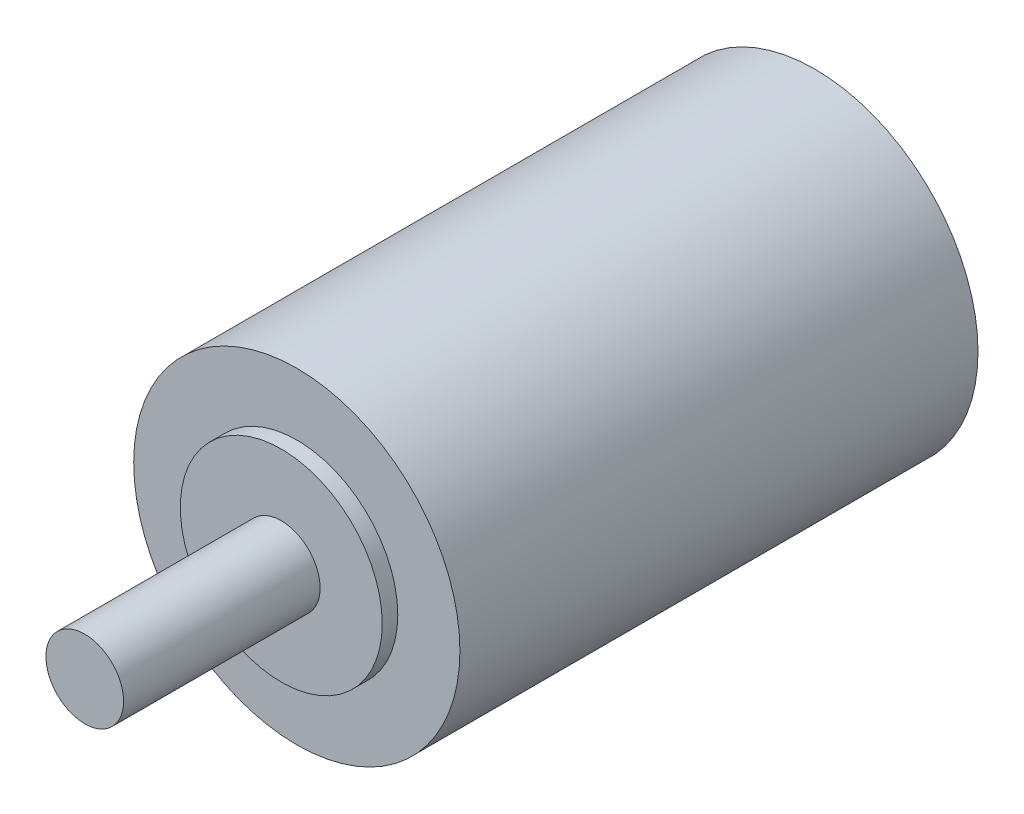
ISO-10303-21;
HEADER;
FILE_DESCRIPTION(('STEP AP214'),'2;1');
FILE_NAME('part.step','',(''),(''),'','','');
FILE_SCHEMA(('AUTOMOTIVE_DESIGN { 1 0 10303 214 1 1 1 1 }'));
ENDSEC;
DATA;
#1=APPLICATION_CONTEXT('core data for automotive mechanical design processes');
#2=APPLICATION_PROTOCOL_DEFINITION('international standard','automotive_design',2000,#1);
#3=PRODUCT_CONTEXT('',#1,'mechanical');
#4=PRODUCT('Part','Part','',(#3));
#5=PRODUCT_RELATED_PRODUCT_CATEGORY('part','',(#4));
#6=PRODUCT_DEFINITION_FORMATION('','',#4);
#7=PRODUCT_DEFINITION_CONTEXT('part definition',#1,'design');
#8=PRODUCT_DEFINITION('design','',#6,#7);
#9=PRODUCT_DEFINITION_SHAPE('','',#8);
#10=(LENGTH_UNIT() NAMED_UNIT(*) SI_UNIT(.MILLI.,.METRE.));
#11=(NAMED_UNIT(*) PLANE_ANGLE_UNIT() SI_UNIT($,.RADIAN.));
#12=(NAMED_UNIT(*) SI_UNIT($,.STERADIAN.) SOLID_ANGLE_UNIT());
#13=UNCERTAINTY_MEASURE_WITH_UNIT(LENGTH_MEASURE(1.E-05),#10,'distance_accuracy_value','');
#14=(GEOMETRIC_REPRESENTATION_CONTEXT(3) GLOBAL_UNCERTAINTY_ASSIGNED_CONTEXT((#13)) GLOBAL_UNIT_ASSIGNED_CONTEXT((#10,
#11,#12)) REPRESENTATION_CONTEXT('',''));
#15=CARTESIAN_POINT('',(0.,0.,0.));
#16=DIRECTION('',(0.,0.,1.));
#17=DIRECTION('',(1.,0.,0.));
#18=AXIS2_PLACEMENT_3D('',#15,#16,#17);
#19=CARTESIAN_POINT('',(0.,0.,94.));
#20=DIRECTION('',(0.,0.,1.));
#21=DIRECTION('',(1.,0.,0.));
#22=AXIS2_PLACEMENT_3D('',#19,#20,#21);
#23=PLANE('',#22);
#24=CARTESIAN_POINT('',(0.,0.,94.));
#25=DIRECTION('',(0.,0.,1.));
#26=DIRECTION('',(1.,0.,0.));
#27=AXIS2_PLACEMENT_3D('',#24,#25,#26);
#28=CIRCLE('',#27,5.);
#29=CARTESIAN_POINT('',(5.,0.,94.));
#30=VERTEX_POINT('',#29);
#31=EDGE_CURVE('E11',#30,#30,#28,.T.);
#32=ORIENTED_EDGE('',*,*,#31,.T.);
#33=EDGE_LOOP('',(#32));
#34=FACE_BOUND('',#33,.T.);
#35=ADVANCED_FACE('F17',(#34),#23,.T.);
#36=CARTESIAN_POINT('',(0.,0.,94.));
#37=DIRECTION('',(0.,0.,-1.));
#38=DIRECTION('',(-1.,0.,0.));
#39=AXIS2_PLACEMENT_3D('',#36,#37,#38);
#40=CYLINDRICAL_SURFACE('',#39,5.);
#41=CARTESIAN_POINT('',(0.,0.,68.7));
#42=DIRECTION('',(0.,0.,1.));
#43=DIRECTION('',(1.,0.,0.));
#44=AXIS2_PLACEMENT_3D('',#41,#42,#43);
#45=CIRCLE('',#44,5.);
#46=CARTESIAN_POINT('',(5.,0.,68.7));
#47=VERTEX_POINT('',#46);
#48=EDGE_CURVE('E95',#47,#47,#45,.T.);
#49=ORIENTED_EDGE('',*,*,#48,.T.);
#50=EDGE_LOOP('',(#49));
#51=FACE_BOUND('',#50,.T.);
#52=ORIENTED_EDGE('',*,*,#31,.F.);
#53=EDGE_LOOP('',(#52));
#54=FACE_BOUND('',#53,.T.);
#55=ADVANCED_FACE('F186',(#51,#54),#40,.T.);
#56=CARTESIAN_POINT('',(0.,0.,-4.4));
#57=DIRECTION('',(0.,0.,-1.));
#58=DIRECTION('',(0.,-1.,0.));
#59=AXIS2_PLACEMENT_3D('',#56,#57,#58);
#60=PLANE('',#59);
#61=CARTESIAN_POINT('',(0.,0.,-4.4));
#62=DIRECTION('',(0.,0.,-1.));
#63=DIRECTION('',(1.,0.,0.));
#64=AXIS2_PLACEMENT_3D('',#61,#62,#63);
#65=CIRCLE('',#64,2.2);
#66=CARTESIAN_POINT('',(2.2,0.,-4.4));
#67=VERTEX_POINT('',#66);
#68=EDGE_CURVE('E27',#67,#67,#65,.T.);
#69=ORIENTED_EDGE('',*,*,#68,.T.);
#70=EDGE_LOOP('',(#69));
#71=FACE_BOUND('',#70,.T.);
#72=ADVANCED_FACE('F167',(#71),#60,.T.);
#73=CARTESIAN_POINT('',(0.,0.,-4.4));
#74=DIRECTION('',(0.,0.,1.));
#75=DIRECTION('',(1.,0.,0.));
#76=AXIS2_PLACEMENT_3D('',#73,#74,#75);
#77=CYLINDRICAL_SURFACE('',#76,2.2);
#78=CARTESIAN_POINT('',(0.,0.,0.));
#79=DIRECTION('',(0.,0.,-1.));
#80=DIRECTION('',(1.,0.,0.));
#81=AXIS2_PLACEMENT_3D('',#78,#79,#80);
#82=CIRCLE('',#81,2.2);
#83=CARTESIAN_POINT('',(2.2,0.,0.));
#84=VERTEX_POINT('',#83);
#85=EDGE_CURVE('E61',#84,#84,#82,.T.);
#86=ORIENTED_EDGE('',*,*,#85,.T.);
#87=EDGE_LOOP('',(#86));
#88=FACE_BOUND('',#87,.T.);
#89=ORIENTED_EDGE('',*,*,#68,.F.);
#90=EDGE_LOOP('',(#89));
#91=FACE_BOUND('',#90,.T.);
#92=ADVANCED_FACE('F161',(#88,#91),#77,.T.);
#93=CARTESIAN_POINT('',(0.,0.,68.7));
#94=DIRECTION('',(0.,0.,1.));
#95=DIRECTION('',(1.,0.,0.));
#96=AXIS2_PLACEMENT_3D('',#93,#94,#95);
#97=PLANE('',#96);
#98=CARTESIAN_POINT('',(0.,0.,68.7));
#99=DIRECTION('',(0.,0.,1.));
#100=DIRECTION('',(1.,0.,0.));
#101=AXIS2_PLACEMENT_3D('',#98,#99,#100);
#102=CIRCLE('',#101,13.);
#103=CARTESIAN_POINT('',(13.,0.,68.7));
#104=VERTEX_POINT('',#103);
#105=EDGE_CURVE('E67',#104,#104,#102,.T.);
#106=ORIENTED_EDGE('',*,*,#105,.T.);
#107=EDGE_LOOP('',(#106));
#108=FACE_BOUND('',#107,.T.);
#109=ORIENTED_EDGE('',*,*,#48,.F.);
#110=EDGE_LOOP('',(#109));
#111=FACE_BOUND('',#110,.T.);
#112=ADVANCED_FACE('F166',(#108,#111),#97,.T.);
#113=CARTESIAN_POINT('',(0.,0.,68.7));
#114=DIRECTION('',(0.,0.,-1.));
#115=DIRECTION('',(-1.,0.,0.));
#116=AXIS2_PLACEMENT_3D('',#113,#114,#115);
#117=CYLINDRICAL_SURFACE('',#116,13.);
#118=CARTESIAN_POINT('',(0.,0.,66.7));
#119=DIRECTION('',(0.,0.,1.));
#120=DIRECTION('',(1.,0.,0.));
#121=AXIS2_PLACEMENT_3D('',#118,#119,#120);
#122=CIRCLE('',#121,13.);
#123=CARTESIAN_POINT('',(13.,0.,66.7));
#124=VERTEX_POINT('',#123);
#125=EDGE_CURVE('E85',#124,#124,#122,.T.);
#126=ORIENTED_EDGE('',*,*,#125,.T.);
#127=EDGE_LOOP('',(#126));
#128=FACE_BOUND('',#127,.T.);
#129=ORIENTED_EDGE('',*,*,#105,.F.);
#130=EDGE_LOOP('',(#129));
#131=FACE_BOUND('',#130,.T.);
#132=ADVANCED_FACE('F19',(#128,#131),#117,.T.);
#133=CARTESIAN_POINT('',(0.,0.,0.));
#134=DIRECTION('',(0.,0.,-1.));
#135=DIRECTION('',(0.,-1.,0.));
#136=AXIS2_PLACEMENT_3D('',#133,#134,#135);
#137=PLANE('',#136);
#138=CARTESIAN_POINT('',(0.,0.,0.));
#139=DIRECTION('',(0.,0.,-1.));
#140=DIRECTION('',(1.,0.,0.));
#141=AXIS2_PLACEMENT_3D('',#138,#139,#140);
#142=CIRCLE('',#141,21.);
#143=CARTESIAN_POINT('',(21.,0.,0.));
#144=VERTEX_POINT('',#143);
#145=EDGE_CURVE('E80',#144,#144,#142,.T.);
#146=ORIENTED_EDGE('',*,*,#145,.T.);
#147=EDGE_LOOP('',(#146));
#148=FACE_BOUND('',#147,.T.);
#149=ORIENTED_EDGE('',*,*,#85,.F.);
#150=EDGE_LOOP('',(#149));
#151=FACE_BOUND('',#150,.T.);
#152=ADVANCED_FACE('F81',(#148,#151),#137,.T.);
#153=CARTESIAN_POINT('',(0.,0.,66.7));
#154=DIRECTION('',(0.,0.,-1.));
#155=DIRECTION('',(0.,-1.,0.));
#156=AXIS2_PLACEMENT_3D('',#153,#154,#155);
#157=PLANE('',#156);
#158=CARTESIAN_POINT('',(0.,0.,66.7));
#159=DIRECTION('',(0.,0.,-1.));
#160=DIRECTION('',(1.,0.,0.));
#161=AXIS2_PLACEMENT_3D('',#158,#159,#160);
#162=CIRCLE('',#161,21.);
#163=CARTESIAN_POINT('',(21.,0.,66.7));
#164=VERTEX_POINT('',#163);
#165=EDGE_CURVE('E21',#164,#164,#162,.T.);
#166=ORIENTED_EDGE('',*,*,#165,.F.);
#167=EDGE_LOOP('',(#166));
#168=FACE_BOUND('',#167,.T.);
#169=ORIENTED_EDGE('',*,*,#125,.F.);
#170=EDGE_LOOP('',(#169));
#171=FACE_BOUND('',#170,.T.);
#172=ADVANCED_FACE('F134',(#168,#171),#157,.F.);
#173=CARTESIAN_POINT('',(0.,0.,66.7));
#174=DIRECTION('',(0.,0.,-1.));
#175=DIRECTION('',(-1.,0.,0.));
#176=AXIS2_PLACEMENT_3D('',#173,#174,#175);
#177=CYLINDRICAL_SURFACE('',#176,21.);
#178=ORIENTED_EDGE('',*,*,#145,.F.);
#179=EDGE_LOOP('',(#178));
#180=FACE_BOUND('',#179,.T.);
#181=ORIENTED_EDGE('',*,*,#165,.T.);
#182=EDGE_LOOP('',(#181));
#183=FACE_BOUND('',#182,.T.);
#184=ADVANCED_FACE('F128',(#180,#183),#177,.T.);
#185=CLOSED_SHELL('',(#35,#55,#72,#92,#112,#132,#152,#172,#184));
#186=MANIFOLD_SOLID_BREP('B1',#185);
#187=ADVANCED_BREP_SHAPE_REPRESENTATION('',(#18,#186),#14);
#188=SHAPE_DEFINITION_REPRESENTATION(#9,#187);
ENDSEC;
END-ISO-10303-21;
